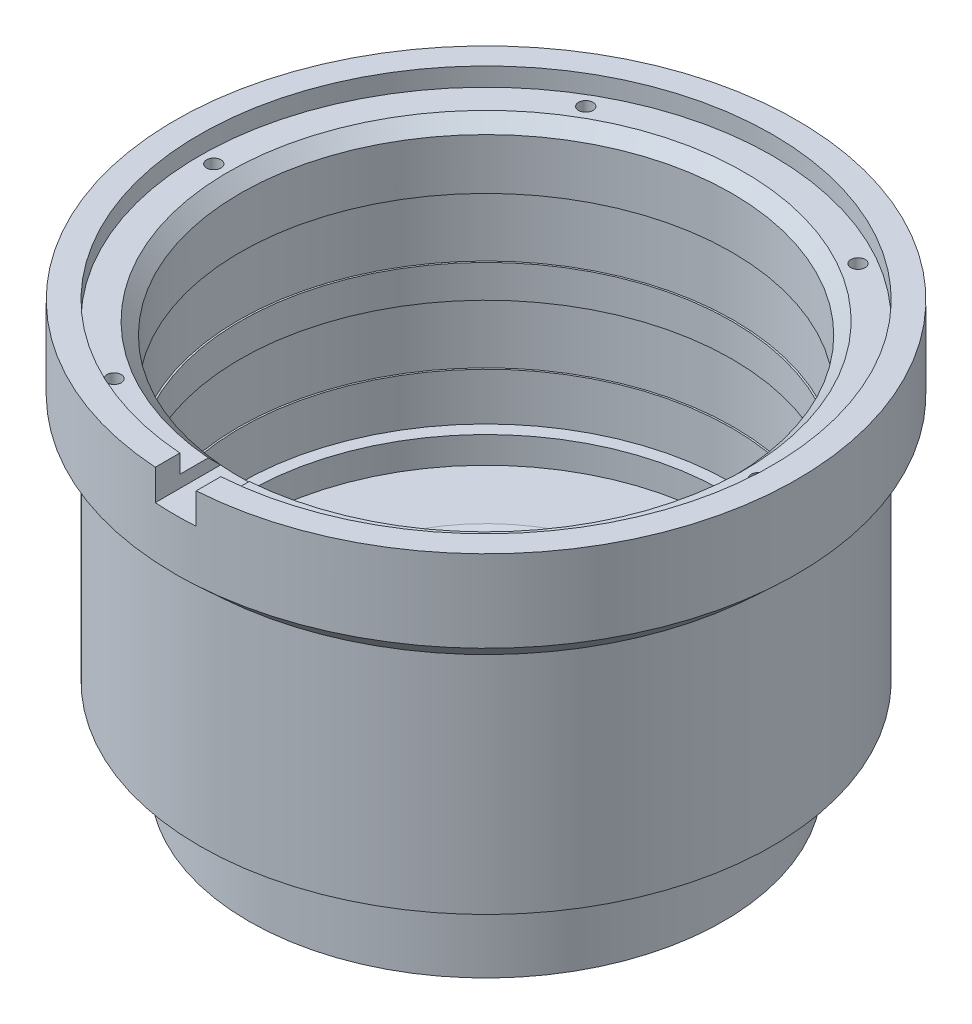
ISO-10303-21;
HEADER;
FILE_DESCRIPTION(('STEP AP214'),'2;1');
FILE_NAME('part.step','',(''),(''),'','','');
FILE_SCHEMA(('AUTOMOTIVE_DESIGN { 1 0 10303 214 1 1 1 1 }'));
ENDSEC;
DATA;
#1=APPLICATION_CONTEXT('core data for automotive mechanical design processes');
#2=APPLICATION_PROTOCOL_DEFINITION('international standard','automotive_design',2000,#1);
#3=PRODUCT_CONTEXT('',#1,'mechanical');
#4=PRODUCT('Part','Part','',(#3));
#5=PRODUCT_RELATED_PRODUCT_CATEGORY('part','',(#4));
#6=PRODUCT_DEFINITION_FORMATION('','',#4);
#7=PRODUCT_DEFINITION_CONTEXT('part definition',#1,'design');
#8=PRODUCT_DEFINITION('design','',#6,#7);
#9=PRODUCT_DEFINITION_SHAPE('','',#8);
#10=(LENGTH_UNIT() NAMED_UNIT(*) SI_UNIT(.MILLI.,.METRE.));
#11=(NAMED_UNIT(*) PLANE_ANGLE_UNIT() SI_UNIT($,.RADIAN.));
#12=(NAMED_UNIT(*) SI_UNIT($,.STERADIAN.) SOLID_ANGLE_UNIT());
#13=UNCERTAINTY_MEASURE_WITH_UNIT(LENGTH_MEASURE(1.E-05),#10,'distance_accuracy_value','');
#14=(GEOMETRIC_REPRESENTATION_CONTEXT(3) GLOBAL_UNCERTAINTY_ASSIGNED_CONTEXT((#13)) GLOBAL_UNIT_ASSIGNED_CONTEXT((#10,
#11,#12)) REPRESENTATION_CONTEXT('',''));
#15=CARTESIAN_POINT('',(0.,0.,0.));
#16=DIRECTION('',(0.,0.,1.));
#17=DIRECTION('',(1.,0.,0.));
#18=AXIS2_PLACEMENT_3D('',#15,#16,#17);
#19=CARTESIAN_POINT('',(0.,-30.2318711174091,0.));
#20=DIRECTION('',(0.,-1.,0.));
#21=DIRECTION('',(0.,0.,-1.));
#22=AXIS2_PLACEMENT_3D('',#19,#20,#21);
#23=CYLINDRICAL_SURFACE('',#22,30.0375);
#24=CARTESIAN_POINT('',(0.,34.31,0.));
#25=DIRECTION('',(0.,-1.,0.));
#26=DIRECTION('',(0.,0.,-1.));
#27=AXIS2_PLACEMENT_3D('',#24,#25,#26);
#28=CIRCLE('',#27,30.0375);
#29=CARTESIAN_POINT('',(-2.5,34.31,29.9332825839399));
#30=VERTEX_POINT('',#29);
#31=CARTESIAN_POINT('',(2.5,34.31,29.9332825839399));
#32=VERTEX_POINT('',#31);
#33=EDGE_CURVE('E111',#30,#32,#28,.F.);
#34=ORIENTED_EDGE('',*,*,#33,.T.);
#35=EDGE_CURVE('E117',#32,#30,#28,.F.);
#36=ORIENTED_EDGE('',*,*,#35,.T.);
#37=EDGE_LOOP('',(#34,#36));
#38=FACE_BOUND('',#37,.T.);
#39=CARTESIAN_POINT('',(0.,28.0847222222222,0.));
#40=DIRECTION('',(0.,-1.,0.));
#41=DIRECTION('',(0.,0.,-1.));
#42=AXIS2_PLACEMENT_3D('',#39,#40,#41);
#43=CIRCLE('',#42,30.0375);
#44=CARTESIAN_POINT('',(0.,28.0847222222222,-30.0375));
#45=VERTEX_POINT('',#44);
#46=EDGE_CURVE('E338',#45,#45,#43,.T.);
#47=ORIENTED_EDGE('',*,*,#46,.T.);
#48=EDGE_LOOP('',(#47));
#49=FACE_BOUND('',#48,.T.);
#50=ADVANCED_FACE('F41',(#38,#49),#23,.F.);
#51=CARTESIAN_POINT('',(0.,3.68801270189219,0.));
#52=DIRECTION('',(0.,-1.,0.));
#53=DIRECTION('',(0.,0.,-1.));
#54=AXIS2_PLACEMENT_3D('',#51,#52,#53);
#55=CIRCLE('',#54,30.0375);
#56=CARTESIAN_POINT('',(0.,3.68801270189219,-30.0375));
#57=VERTEX_POINT('',#56);
#58=EDGE_CURVE('E335',#57,#57,#55,.T.);
#59=ORIENTED_EDGE('',*,*,#58,.T.);
#60=EDGE_LOOP('',(#59));
#61=FACE_BOUND('',#60,.T.);
#62=CARTESIAN_POINT('',(0.,9.48027777777775,0.));
#63=DIRECTION('',(0.,-1.,0.));
#64=DIRECTION('',(0.,0.,-1.));
#65=AXIS2_PLACEMENT_3D('',#62,#63,#64);
#66=CIRCLE('',#65,30.0375);
#67=CARTESIAN_POINT('',(0.,9.48027777777775,-30.0375));
#68=VERTEX_POINT('',#67);
#69=EDGE_CURVE('E339',#68,#68,#66,.T.);
#70=ORIENTED_EDGE('',*,*,#69,.F.);
#71=EDGE_LOOP('',(#70));
#72=FACE_BOUND('',#71,.T.);
#73=ADVANCED_FACE('F160',(#61,#72),#23,.F.);
#74=CARTESIAN_POINT('',(-12.,-13.19,0.));
#75=DIRECTION('',(0.,1.,0.));
#76=DIRECTION('',(0.,0.,1.));
#77=AXIS2_PLACEMENT_3D('',#74,#75,#76);
#78=PLANE('',#77);
#79=CARTESIAN_POINT('',(0.,-13.19,0.));
#80=DIRECTION('',(0.,-1.,0.));
#81=DIRECTION('',(0.,0.,-1.));
#82=AXIS2_PLACEMENT_3D('',#79,#80,#81);
#83=CIRCLE('',#82,12.);
#84=CARTESIAN_POINT('',(0.,-13.19,-12.));
#85=VERTEX_POINT('',#84);
#86=EDGE_CURVE('E226',#85,#85,#83,.T.);
#87=ORIENTED_EDGE('',*,*,#86,.F.);
#88=EDGE_LOOP('',(#87));
#89=FACE_BOUND('',#88,.T.);
#90=CARTESIAN_POINT('',(-12.5,-13.19,21.650635094611));
#91=DIRECTION('',(0.,-1.,0.));
#92=DIRECTION('',(0.,0.,-1.));
#93=AXIS2_PLACEMENT_3D('',#90,#91,#92);
#94=CIRCLE('',#93,1.375);
#95=CARTESIAN_POINT('',(-12.5,-13.19,20.275635094611));
#96=VERTEX_POINT('',#95);
#97=EDGE_CURVE('E304',#96,#96,#94,.T.);
#98=ORIENTED_EDGE('',*,*,#97,.F.);
#99=EDGE_LOOP('',(#98));
#100=FACE_BOUND('',#99,.T.);
#101=CARTESIAN_POINT('',(12.5,-13.19,21.650635094611));
#102=DIRECTION('',(0.,-1.,0.));
#103=DIRECTION('',(0.,0.,-1.));
#104=AXIS2_PLACEMENT_3D('',#101,#102,#103);
#105=CIRCLE('',#104,1.375);
#106=CARTESIAN_POINT('',(12.5,-13.19,20.275635094611));
#107=VERTEX_POINT('',#106);
#108=EDGE_CURVE('E298',#107,#107,#105,.T.);
#109=ORIENTED_EDGE('',*,*,#108,.F.);
#110=EDGE_LOOP('',(#109));
#111=FACE_BOUND('',#110,.T.);
#112=CARTESIAN_POINT('',(25.,-13.19,0.));
#113=DIRECTION('',(0.,-1.,0.));
#114=DIRECTION('',(0.,0.,-1.));
#115=AXIS2_PLACEMENT_3D('',#112,#113,#114);
#116=CIRCLE('',#115,1.375);
#117=CARTESIAN_POINT('',(25.,-13.19,-1.375));
#118=VERTEX_POINT('',#117);
#119=EDGE_CURVE('E292',#118,#118,#116,.T.);
#120=ORIENTED_EDGE('',*,*,#119,.F.);
#121=EDGE_LOOP('',(#120));
#122=FACE_BOUND('',#121,.T.);
#123=CARTESIAN_POINT('',(12.5,-13.19,-21.650635094611));
#124=DIRECTION('',(0.,-1.,0.));
#125=DIRECTION('',(0.,0.,-1.));
#126=AXIS2_PLACEMENT_3D('',#123,#124,#125);
#127=CIRCLE('',#126,1.375);
#128=CARTESIAN_POINT('',(12.5,-13.19,-23.025635094611));
#129=VERTEX_POINT('',#128);
#130=EDGE_CURVE('E285',#129,#129,#127,.T.);
#131=ORIENTED_EDGE('',*,*,#130,.F.);
#132=EDGE_LOOP('',(#131));
#133=FACE_BOUND('',#132,.T.);
#134=CARTESIAN_POINT('',(-12.5,-13.19,-21.650635094611));
#135=DIRECTION('',(0.,-1.,0.));
#136=DIRECTION('',(0.,0.,-1.));
#137=AXIS2_PLACEMENT_3D('',#134,#135,#136);
#138=CIRCLE('',#137,1.375);
#139=CARTESIAN_POINT('',(-12.5,-13.19,-23.025635094611));
#140=VERTEX_POINT('',#139);
#141=EDGE_CURVE('E286',#140,#140,#138,.T.);
#142=ORIENTED_EDGE('',*,*,#141,.F.);
#143=EDGE_LOOP('',(#142));
#144=FACE_BOUND('',#143,.T.);
#145=CARTESIAN_POINT('',(-25.,-13.19,0.));
#146=DIRECTION('',(0.,-1.,0.));
#147=DIRECTION('',(0.,0.,-1.));
#148=AXIS2_PLACEMENT_3D('',#145,#146,#147);
#149=CIRCLE('',#148,1.375);
#150=CARTESIAN_POINT('',(-25.,-13.19,-1.375));
#151=VERTEX_POINT('',#150);
#152=EDGE_CURVE('E307',#151,#151,#149,.T.);
#153=ORIENTED_EDGE('',*,*,#152,.F.);
#154=EDGE_LOOP('',(#153));
#155=FACE_BOUND('',#154,.T.);
#156=CARTESIAN_POINT('',(0.,-13.19,0.));
#157=DIRECTION('',(0.,1.,0.));
#158=DIRECTION('',(0.,0.,1.));
#159=AXIS2_PLACEMENT_3D('',#156,#157,#158);
#160=CIRCLE('',#159,29.);
#161=CARTESIAN_POINT('',(0.,-13.19,29.));
#162=VERTEX_POINT('',#161);
#163=EDGE_CURVE('E311',#162,#162,#160,.T.);
#164=ORIENTED_EDGE('',*,*,#163,.F.);
#165=EDGE_LOOP('',(#164));
#166=FACE_BOUND('',#165,.T.);
#167=ADVANCED_FACE('F156',(#89,#100,#111,#122,#133,#144,#155,#166),#78,.F.);
#168=CARTESIAN_POINT('',(-38.,38.06,0.));
#169=DIRECTION('',(0.,-1.,0.));
#170=DIRECTION('',(0.,0.,-1.));
#171=AXIS2_PLACEMENT_3D('',#168,#169,#170);
#172=PLANE('',#171);
#173=CARTESIAN_POINT('',(0.,38.06,0.));
#174=DIRECTION('',(0.,-1.,0.));
#175=DIRECTION('',(0.,0.,-1.));
#176=AXIS2_PLACEMENT_3D('',#173,#174,#175);
#177=CIRCLE('',#176,35.);
#178=CARTESIAN_POINT('',(-2.5,38.06,34.9106001094224));
#179=VERTEX_POINT('',#178);
#180=CARTESIAN_POINT('',(2.5,38.06,34.9106001094224));
#181=VERTEX_POINT('',#180);
#182=EDGE_CURVE('E203',#179,#181,#177,.T.);
#183=ORIENTED_EDGE('',*,*,#182,.T.);
#184=DIRECTION('',(0.,0.,-1.));
#185=VECTOR('',#184,1.);
#186=CARTESIAN_POINT('',(2.5,38.06,38.));
#187=LINE('',#186,#185);
#188=CARTESIAN_POINT('',(2.5,38.06,37.9176739792936));
#189=VERTEX_POINT('',#188);
#190=EDGE_CURVE('E114',#189,#181,#187,.T.);
#191=ORIENTED_EDGE('',*,*,#190,.F.);
#192=CARTESIAN_POINT('',(0.,38.06,0.));
#193=DIRECTION('',(0.,-1.,0.));
#194=DIRECTION('',(0.,0.,-1.));
#195=AXIS2_PLACEMENT_3D('',#192,#193,#194);
#196=CIRCLE('',#195,38.);
#197=CARTESIAN_POINT('',(-2.5,38.06,37.9176739792936));
#198=VERTEX_POINT('',#197);
#199=EDGE_CURVE('E208',#198,#189,#196,.T.);
#200=ORIENTED_EDGE('',*,*,#199,.F.);
#201=DIRECTION('',(0.,0.,1.));
#202=VECTOR('',#201,1.);
#203=CARTESIAN_POINT('',(-2.5,38.06,38.));
#204=LINE('',#203,#202);
#205=EDGE_CURVE('E206',#179,#198,#204,.T.);
#206=ORIENTED_EDGE('',*,*,#205,.F.);
#207=EDGE_LOOP('',(#183,#191,#200,#206));
#208=FACE_BOUND('',#207,.T.);
#209=ADVANCED_FACE('F159',(#208),#172,.F.);
#210=CARTESIAN_POINT('',(0.,-30.2318711174091,0.));
#211=DIRECTION('',(0.,-1.,0.));
#212=DIRECTION('',(0.,0.,-1.));
#213=AXIS2_PLACEMENT_3D('',#210,#211,#212);
#214=CYLINDRICAL_SURFACE('',#213,35.);
#215=CARTESIAN_POINT('',(0.,35.81,0.));
#216=DIRECTION('',(0.,-1.,0.));
#217=DIRECTION('',(0.,0.,-1.));
#218=AXIS2_PLACEMENT_3D('',#215,#216,#217);
#219=CIRCLE('',#218,35.);
#220=CARTESIAN_POINT('',(-2.49999999999999,35.81,34.9106001094224));
#221=VERTEX_POINT('',#220);
#222=CARTESIAN_POINT('',(2.5,35.81,34.9106001094224));
#223=VERTEX_POINT('',#222);
#224=EDGE_CURVE('E209',#221,#223,#219,.T.);
#225=ORIENTED_EDGE('',*,*,#224,.T.);
#226=DIRECTION('',(0.,-1.,0.));
#227=VECTOR('',#226,1.);
#228=CARTESIAN_POINT('',(2.5,-30.2318711174091,34.9106001094224));
#229=LINE('',#228,#227);
#230=EDGE_CURVE('E70',#223,#181,#229,.F.);
#231=ORIENTED_EDGE('',*,*,#230,.T.);
#232=ORIENTED_EDGE('',*,*,#182,.F.);
#233=DIRECTION('',(0.,-1.,0.));
#234=VECTOR('',#233,1.);
#235=CARTESIAN_POINT('',(-2.49999999999999,-30.2318711174091,34.9106001094224));
#236=LINE('',#235,#234);
#237=EDGE_CURVE('E237',#179,#221,#236,.T.);
#238=ORIENTED_EDGE('',*,*,#237,.T.);
#239=EDGE_LOOP('',(#225,#231,#232,#238));
#240=FACE_BOUND('',#239,.T.);
#241=ADVANCED_FACE('F191',(#240),#214,.F.);
#242=CARTESIAN_POINT('',(-35.,35.81,0.));
#243=DIRECTION('',(0.,-1.,0.));
#244=DIRECTION('',(0.,0.,-1.));
#245=AXIS2_PLACEMENT_3D('',#242,#243,#244);
#246=PLANE('',#245);
#247=CARTESIAN_POINT('',(-33.26875,35.81,0.));
#248=DIRECTION('',(0.,1.,0.));
#249=DIRECTION('',(0.,0.,1.));
#250=AXIS2_PLACEMENT_3D('',#247,#248,#249);
#251=CIRCLE('',#250,0.874999999999998);
#252=CARTESIAN_POINT('',(-33.26875,35.81,0.874999999999999));
#253=VERTEX_POINT('',#252);
#254=EDGE_CURVE('E271',#253,#253,#251,.T.);
#255=ORIENTED_EDGE('',*,*,#254,.F.);
#256=EDGE_LOOP('',(#255));
#257=FACE_BOUND('',#256,.T.);
#258=CARTESIAN_POINT('',(-16.634375,35.81,28.8115826521536));
#259=DIRECTION('',(0.,1.,0.));
#260=DIRECTION('',(0.,0.,1.));
#261=AXIS2_PLACEMENT_3D('',#258,#259,#260);
#262=CIRCLE('',#261,0.875000000000002);
#263=CARTESIAN_POINT('',(-16.634375,35.81,29.6865826521536));
#264=VERTEX_POINT('',#263);
#265=EDGE_CURVE('E250',#264,#264,#262,.T.);
#266=ORIENTED_EDGE('',*,*,#265,.F.);
#267=EDGE_LOOP('',(#266));
#268=FACE_BOUND('',#267,.T.);
#269=CARTESIAN_POINT('',(16.634375,35.81,28.8115826521536));
#270=DIRECTION('',(0.,1.,0.));
#271=DIRECTION('',(0.,0.,1.));
#272=AXIS2_PLACEMENT_3D('',#269,#270,#271);
#273=CIRCLE('',#272,0.875000000000002);
#274=CARTESIAN_POINT('',(16.634375,35.81,29.6865826521536));
#275=VERTEX_POINT('',#274);
#276=EDGE_CURVE('E249',#275,#275,#273,.T.);
#277=ORIENTED_EDGE('',*,*,#276,.F.);
#278=EDGE_LOOP('',(#277));
#279=FACE_BOUND('',#278,.T.);
#280=CARTESIAN_POINT('',(33.26875,35.81,0.));
#281=DIRECTION('',(0.,1.,0.));
#282=DIRECTION('',(0.,0.,1.));
#283=AXIS2_PLACEMENT_3D('',#280,#281,#282);
#284=CIRCLE('',#283,0.874999999999998);
#285=CARTESIAN_POINT('',(33.26875,35.81,0.874999999999994));
#286=VERTEX_POINT('',#285);
#287=EDGE_CURVE('E256',#286,#286,#284,.T.);
#288=ORIENTED_EDGE('',*,*,#287,.F.);
#289=EDGE_LOOP('',(#288));
#290=FACE_BOUND('',#289,.T.);
#291=CARTESIAN_POINT('',(16.634375,35.81,-28.8115826521536));
#292=DIRECTION('',(0.,1.,0.));
#293=DIRECTION('',(0.,0.,1.));
#294=AXIS2_PLACEMENT_3D('',#291,#292,#293);
#295=CIRCLE('',#294,0.875000000000002);
#296=CARTESIAN_POINT('',(16.634375,35.81,-27.9365826521536));
#297=VERTEX_POINT('',#296);
#298=EDGE_CURVE('E262',#297,#297,#295,.T.);
#299=ORIENTED_EDGE('',*,*,#298,.F.);
#300=EDGE_LOOP('',(#299));
#301=FACE_BOUND('',#300,.T.);
#302=CARTESIAN_POINT('',(-16.634375,35.81,-28.8115826521536));
#303=DIRECTION('',(0.,1.,0.));
#304=DIRECTION('',(0.,0.,1.));
#305=AXIS2_PLACEMENT_3D('',#302,#303,#304);
#306=CIRCLE('',#305,0.875000000000002);
#307=CARTESIAN_POINT('',(-16.634375,35.81,-27.9365826521536));
#308=VERTEX_POINT('',#307);
#309=EDGE_CURVE('E268',#308,#308,#306,.T.);
#310=ORIENTED_EDGE('',*,*,#309,.F.);
#311=EDGE_LOOP('',(#310));
#312=FACE_BOUND('',#311,.T.);
#313=CARTESIAN_POINT('',(0.,35.81,0.));
#314=DIRECTION('',(0.,-1.,0.));
#315=DIRECTION('',(0.,0.,-1.));
#316=AXIS2_PLACEMENT_3D('',#313,#314,#315);
#317=CIRCLE('',#316,31.5375);
#318=CARTESIAN_POINT('',(-2.5,35.81,31.4382554581199));
#319=VERTEX_POINT('',#318);
#320=CARTESIAN_POINT('',(2.5,35.81,31.4382554581199));
#321=VERTEX_POINT('',#320);
#322=EDGE_CURVE('E120',#319,#321,#317,.T.);
#323=ORIENTED_EDGE('',*,*,#322,.T.);
#324=DIRECTION('',(0.,0.,1.));
#325=VECTOR('',#324,1.);
#326=CARTESIAN_POINT('',(2.49999999999999,35.81,0.));
#327=LINE('',#326,#325);
#328=EDGE_CURVE('E103',#321,#223,#327,.T.);
#329=ORIENTED_EDGE('',*,*,#328,.T.);
#330=ORIENTED_EDGE('',*,*,#224,.F.);
#331=DIRECTION('',(0.,0.,-1.));
#332=VECTOR('',#331,1.);
#333=CARTESIAN_POINT('',(-2.5,35.81,0.));
#334=LINE('',#333,#332);
#335=EDGE_CURVE('E239',#221,#319,#334,.T.);
#336=ORIENTED_EDGE('',*,*,#335,.T.);
#337=EDGE_LOOP('',(#323,#329,#330,#336));
#338=FACE_BOUND('',#337,.T.);
#339=ADVANCED_FACE('F184',(#257,#268,#279,#290,#301,#312,#338),#246,.F.);
#340=CARTESIAN_POINT('',(-30.0375,3.255,0.));
#341=DIRECTION('',(0.,-1.,0.));
#342=DIRECTION('',(0.,0.,-1.));
#343=AXIS2_PLACEMENT_3D('',#340,#341,#342);
#344=PLANE('',#343);
#345=CARTESIAN_POINT('',(0.,3.25500000000002,0.));
#346=DIRECTION('',(0.,-1.,0.));
#347=DIRECTION('',(0.,0.,-1.));
#348=AXIS2_PLACEMENT_3D('',#345,#346,#347);
#349=CIRCLE('',#348,29.0749999999999);
#350=CARTESIAN_POINT('',(0.,3.25500000000002,-29.0749999999999));
#351=VERTEX_POINT('',#350);
#352=EDGE_CURVE('E212',#351,#351,#349,.T.);
#353=ORIENTED_EDGE('',*,*,#352,.T.);
#354=EDGE_LOOP('',(#353));
#355=FACE_BOUND('',#354,.T.);
#356=CARTESIAN_POINT('',(0.,3.25499999999998,0.));
#357=DIRECTION('',(0.,-1.,0.));
#358=DIRECTION('',(0.,0.,-1.));
#359=AXIS2_PLACEMENT_3D('',#356,#357,#358);
#360=CIRCLE('',#359,30.7875);
#361=CARTESIAN_POINT('',(0.,3.25499999999998,-30.7875));
#362=VERTEX_POINT('',#361);
#363=EDGE_CURVE('E332',#362,#362,#360,.T.);
#364=ORIENTED_EDGE('',*,*,#363,.F.);
#365=EDGE_LOOP('',(#364));
#366=FACE_BOUND('',#365,.T.);
#367=ADVANCED_FACE('F180',(#355,#366),#344,.F.);
#368=CARTESIAN_POINT('',(0.,-30.2318711174091,0.));
#369=DIRECTION('',(0.,-1.,0.));
#370=DIRECTION('',(0.,0.,-1.));
#371=AXIS2_PLACEMENT_3D('',#368,#369,#370);
#372=CYLINDRICAL_SURFACE('',#371,29.0749999999999);
#373=ORIENTED_EDGE('',*,*,#352,.F.);
#374=EDGE_LOOP('',(#373));
#375=FACE_BOUND('',#374,.T.);
#376=CARTESIAN_POINT('',(0.,0.,0.));
#377=DIRECTION('',(0.,-1.,0.));
#378=DIRECTION('',(0.,0.,-1.));
#379=AXIS2_PLACEMENT_3D('',#376,#377,#378);
#380=CIRCLE('',#379,29.0749999999999);
#381=CARTESIAN_POINT('',(0.,0.,-29.0749999999999));
#382=VERTEX_POINT('',#381);
#383=EDGE_CURVE('E217',#382,#382,#380,.T.);
#384=ORIENTED_EDGE('',*,*,#383,.T.);
#385=EDGE_LOOP('',(#384));
#386=FACE_BOUND('',#385,.T.);
#387=ADVANCED_FACE('F176',(#375,#386),#372,.F.);
#388=CARTESIAN_POINT('',(-9.,0.,0.));
#389=DIRECTION('',(0.,-1.,0.));
#390=DIRECTION('',(0.,0.,-1.));
#391=AXIS2_PLACEMENT_3D('',#388,#389,#390);
#392=PLANE('',#391);
#393=CARTESIAN_POINT('',(0.,0.,0.));
#394=DIRECTION('',(0.,-1.,0.));
#395=DIRECTION('',(0.,0.,-1.));
#396=AXIS2_PLACEMENT_3D('',#393,#394,#395);
#397=CIRCLE('',#396,20.3425636392354);
#398=CARTESIAN_POINT('',(0.,0.,-20.3425636392354));
#399=VERTEX_POINT('',#398);
#400=EDGE_CURVE('E123',#399,#399,#397,.T.);
#401=ORIENTED_EDGE('',*,*,#400,.T.);
#402=EDGE_LOOP('',(#401));
#403=FACE_BOUND('',#402,.T.);
#404=ORIENTED_EDGE('',*,*,#383,.F.);
#405=EDGE_LOOP('',(#404));
#406=FACE_BOUND('',#405,.T.);
#407=ADVANCED_FACE('F172',(#403,#406),#392,.F.);
#408=CARTESIAN_POINT('',(0.,-30.2318711174091,0.));
#409=DIRECTION('',(0.,-1.,0.));
#410=DIRECTION('',(0.,0.,-1.));
#411=AXIS2_PLACEMENT_3D('',#408,#409,#410);
#412=CYLINDRICAL_SURFACE('',#411,9.);
#413=CARTESIAN_POINT('',(0.,-2.00000000000001,0.));
#414=DIRECTION('',(0.,-1.,0.));
#415=DIRECTION('',(0.,0.,-1.));
#416=AXIS2_PLACEMENT_3D('',#413,#414,#415);
#417=CIRCLE('',#416,9.);
#418=CARTESIAN_POINT('',(0.,-2.00000000000001,-9.));
#419=VERTEX_POINT('',#418);
#420=EDGE_CURVE('E125',#419,#419,#417,.F.);
#421=ORIENTED_EDGE('',*,*,#420,.T.);
#422=EDGE_LOOP('',(#421));
#423=FACE_BOUND('',#422,.T.);
#424=CARTESIAN_POINT('',(0.,-2.94,0.));
#425=DIRECTION('',(0.,-1.,0.));
#426=DIRECTION('',(0.,0.,-1.));
#427=AXIS2_PLACEMENT_3D('',#424,#425,#426);
#428=CIRCLE('',#427,9.);
#429=CARTESIAN_POINT('',(0.,-2.94,-9.));
#430=VERTEX_POINT('',#429);
#431=EDGE_CURVE('E220',#430,#430,#428,.T.);
#432=ORIENTED_EDGE('',*,*,#431,.T.);
#433=EDGE_LOOP('',(#432));
#434=FACE_BOUND('',#433,.T.);
#435=ADVANCED_FACE('F168',(#423,#434),#412,.F.);
#436=CARTESIAN_POINT('',(-9.,-2.94,0.));
#437=DIRECTION('',(0.,1.,0.));
#438=DIRECTION('',(0.,0.,1.));
#439=AXIS2_PLACEMENT_3D('',#436,#437,#438);
#440=PLANE('',#439);
#441=ORIENTED_EDGE('',*,*,#431,.F.);
#442=EDGE_LOOP('',(#441));
#443=FACE_BOUND('',#442,.T.);
#444=CARTESIAN_POINT('',(0.,-2.94,0.));
#445=DIRECTION('',(0.,-1.,0.));
#446=DIRECTION('',(0.,0.,-1.));
#447=AXIS2_PLACEMENT_3D('',#444,#445,#446);
#448=CIRCLE('',#447,12.);
#449=CARTESIAN_POINT('',(0.,-2.94,-12.));
#450=VERTEX_POINT('',#449);
#451=EDGE_CURVE('E223',#450,#450,#448,.T.);
#452=ORIENTED_EDGE('',*,*,#451,.T.);
#453=EDGE_LOOP('',(#452));
#454=FACE_BOUND('',#453,.T.);
#455=ADVANCED_FACE('F164',(#443,#454),#440,.F.);
#456=CARTESIAN_POINT('',(0.,-30.2318711174091,0.));
#457=DIRECTION('',(0.,-1.,0.));
#458=DIRECTION('',(0.,0.,-1.));
#459=AXIS2_PLACEMENT_3D('',#456,#457,#458);
#460=CYLINDRICAL_SURFACE('',#459,12.);
#461=ORIENTED_EDGE('',*,*,#451,.F.);
#462=EDGE_LOOP('',(#461));
#463=FACE_BOUND('',#462,.T.);
#464=ORIENTED_EDGE('',*,*,#86,.T.);
#465=EDGE_LOOP('',(#464));
#466=FACE_BOUND('',#465,.T.);
#467=ADVANCED_FACE('F154',(#463,#466),#460,.F.);
#468=CARTESIAN_POINT('',(0.,-30.2318711174091,0.));
#469=DIRECTION('',(0.,-1.,0.));
#470=DIRECTION('',(0.,0.,-1.));
#471=AXIS2_PLACEMENT_3D('',#468,#469,#470);
#472=CYLINDRICAL_SURFACE('',#471,38.);
#473=CARTESIAN_POINT('',(0.,28.06,0.));
#474=DIRECTION('',(0.,1.,0.));
#475=DIRECTION('',(0.,0.,1.));
#476=AXIS2_PLACEMENT_3D('',#473,#474,#475);
#477=CIRCLE('',#476,38.);
#478=CARTESIAN_POINT('',(0.,28.06,38.));
#479=VERTEX_POINT('',#478);
#480=EDGE_CURVE('E329',#479,#479,#477,.T.);
#481=ORIENTED_EDGE('',*,*,#480,.T.);
#482=EDGE_LOOP('',(#481));
#483=FACE_BOUND('',#482,.T.);
#484=ORIENTED_EDGE('',*,*,#199,.T.);
#485=DIRECTION('',(0.,-1.,0.));
#486=VECTOR('',#485,1.);
#487=CARTESIAN_POINT('',(2.5,-30.2318711174091,37.9176739792936));
#488=LINE('',#487,#486);
#489=CARTESIAN_POINT('',(2.5,34.31,37.9176739792936));
#490=VERTEX_POINT('',#489);
#491=EDGE_CURVE('E230',#189,#490,#488,.T.);
#492=ORIENTED_EDGE('',*,*,#491,.T.);
#493=CARTESIAN_POINT('',(0.,34.31,0.));
#494=DIRECTION('',(0.,-1.,0.));
#495=DIRECTION('',(0.,0.,-1.));
#496=AXIS2_PLACEMENT_3D('',#493,#494,#495);
#497=CIRCLE('',#496,38.);
#498=CARTESIAN_POINT('',(-2.5,34.31,37.9176739792936));
#499=VERTEX_POINT('',#498);
#500=EDGE_CURVE('E113',#490,#499,#497,.T.);
#501=ORIENTED_EDGE('',*,*,#500,.T.);
#502=DIRECTION('',(0.,-1.,0.));
#503=VECTOR('',#502,1.);
#504=CARTESIAN_POINT('',(-2.49999999999999,-30.2318711174091,37.9176739792936));
#505=LINE('',#504,#503);
#506=EDGE_CURVE('E234',#499,#198,#505,.F.);
#507=ORIENTED_EDGE('',*,*,#506,.T.);
#508=EDGE_LOOP('',(#484,#492,#501,#507));
#509=FACE_BOUND('',#508,.T.);
#510=ADVANCED_FACE('F151',(#483,#509),#472,.T.);
#511=CARTESIAN_POINT('',(0.,35.81,0.));
#512=DIRECTION('',(0.,1.,0.));
#513=DIRECTION('',(0.,0.,1.));
#514=AXIS2_PLACEMENT_3D('',#511,#512,#513);
#515=CONICAL_SURFACE('',#514,31.5375,0.785398163397446);
#516=CARTESIAN_POINT('',(2.5,38.0064498760366,33.6411856842019));
#517=CARTESIAN_POINT('',(2.5,37.5159165604655,33.1492992082921));
#518=CARTESIAN_POINT('',(2.5,37.0254123379568,32.6573837168513));
#519=CARTESIAN_POINT('',(2.5,36.0444718161019,31.6734850406488));
#520=CARTESIAN_POINT('',(2.5,35.5540355167539,31.1815018558888));
#521=CARTESIAN_POINT('',(2.5,34.5732405497735,30.197458102226));
#522=CARTESIAN_POINT('',(2.5,34.0828818821416,29.7053975333225));
#523=CARTESIAN_POINT('',(2.5,33.10225516573,28.7211860822988));
#524=CARTESIAN_POINT('',(2.5,32.6119871169527,28.2290352001761));
#525=CARTESIAN_POINT('',(2.5,32.1217708821292,27.7368327079033));
#526=B_SPLINE_CURVE_WITH_KNOTS('',3,(#516,#517,#518,#519,#520,#521,#522,#523,#524,#525),
.UNSPECIFIED.,.F.,.F.,(4,2,2,2,4),(0.,2.08402906775424,4.16805808201208,6.25208711029378,
8.33611619216076),.UNSPECIFIED.);
#527=EDGE_CURVE('E12',#321,#32,#526,.T.);
#528=ORIENTED_EDGE('',*,*,#527,.F.);
#529=ORIENTED_EDGE('',*,*,#322,.F.);
#530=CARTESIAN_POINT('',(-2.5,32.1217708821292,27.7368327079033));
#531=CARTESIAN_POINT('',(-2.5,32.6119871169527,28.2290352001761));
#532=CARTESIAN_POINT('',(-2.5,33.10225516573,28.7211860822988));
#533=CARTESIAN_POINT('',(-2.5,34.0828818821416,29.7053975333225));
#534=CARTESIAN_POINT('',(-2.5,34.5732405497735,30.197458102226));
#535=CARTESIAN_POINT('',(-2.5,35.5540355167539,31.1815018558888));
#536=CARTESIAN_POINT('',(-2.5,36.0444718161019,31.6734850406488));
#537=CARTESIAN_POINT('',(-2.5,37.0254123379568,32.6573837168513));
#538=CARTESIAN_POINT('',(-2.5,37.5159165604655,33.1492992082921));
#539=CARTESIAN_POINT('',(-2.5,38.0064498760366,33.6411856842019));
#540=B_SPLINE_CURVE_WITH_KNOTS('',3,(#530,#531,#532,#533,#534,#535,#536,#537,#538,#539),
.UNSPECIFIED.,.F.,.F.,(4,2,2,2,4),(0.,2.08402908186698,4.16805811014868,6.25208712440652,
8.33611619216076),.UNSPECIFIED.);
#541=EDGE_CURVE('E55',#30,#319,#540,.T.);
#542=ORIENTED_EDGE('',*,*,#541,.F.);
#543=ORIENTED_EDGE('',*,*,#35,.F.);
#544=EDGE_LOOP('',(#528,#529,#542,#543));
#545=FACE_BOUND('',#544,.T.);
#546=ADVANCED_FACE('F118',(#545),#515,.F.);
#547=CARTESIAN_POINT('',(0.,0.,0.));
#548=DIRECTION('',(0.,1.,0.));
#549=DIRECTION('',(0.,0.,1.));
#550=AXIS2_PLACEMENT_3D('',#547,#548,#549);
#551=CONICAL_SURFACE('',#550,20.3425636392354,1.39626340159546);
#552=ORIENTED_EDGE('',*,*,#420,.F.);
#553=EDGE_LOOP('',(#552));
#554=FACE_BOUND('',#553,.T.);
#555=ORIENTED_EDGE('',*,*,#400,.F.);
#556=EDGE_LOOP('',(#555));
#557=FACE_BOUND('',#556,.T.);
#558=ADVANCED_FACE('F44',(#554,#557),#551,.F.);
#559=CARTESIAN_POINT('',(0.,34.31,0.));
#560=DIRECTION('',(0.,-1.,0.));
#561=DIRECTION('',(0.,0.,-1.));
#562=AXIS2_PLACEMENT_3D('',#559,#560,#561);
#563=PLANE('',#562);
#564=DIRECTION('',(0.,0.,-1.));
#565=VECTOR('',#564,1.);
#566=CARTESIAN_POINT('',(2.5,34.31,38.));
#567=LINE('',#566,#565);
#568=EDGE_CURVE('E101',#490,#32,#567,.T.);
#569=ORIENTED_EDGE('',*,*,#568,.T.);
#570=ORIENTED_EDGE('',*,*,#33,.F.);
#571=DIRECTION('',(0.,0.,1.));
#572=VECTOR('',#571,1.);
#573=CARTESIAN_POINT('',(-2.5,34.31,38.));
#574=LINE('',#573,#572);
#575=EDGE_CURVE('E62',#30,#499,#574,.T.);
#576=ORIENTED_EDGE('',*,*,#575,.T.);
#577=ORIENTED_EDGE('',*,*,#500,.F.);
#578=EDGE_LOOP('',(#569,#570,#576,#577));
#579=FACE_BOUND('',#578,.T.);
#580=ADVANCED_FACE('F109',(#579),#563,.F.);
#581=CARTESIAN_POINT('',(2.5,24.8193767396146,38.));
#582=DIRECTION('',(1.,0.,0.));
#583=DIRECTION('',(0.,0.,-1.));
#584=AXIS2_PLACEMENT_3D('',#581,#582,#583);
#585=PLANE('',#584);
#586=ORIENTED_EDGE('',*,*,#190,.T.);
#587=ORIENTED_EDGE('',*,*,#230,.F.);
#588=ORIENTED_EDGE('',*,*,#328,.F.);
#589=ORIENTED_EDGE('',*,*,#527,.T.);
#590=ORIENTED_EDGE('',*,*,#568,.F.);
#591=ORIENTED_EDGE('',*,*,#491,.F.);
#592=EDGE_LOOP('',(#586,#587,#588,#589,#590,#591));
#593=FACE_BOUND('',#592,.T.);
#594=ADVANCED_FACE('F100',(#593),#585,.F.);
#595=CARTESIAN_POINT('',(-2.5,24.8193767396146,38.));
#596=DIRECTION('',(-1.,0.,0.));
#597=DIRECTION('',(0.,0.,1.));
#598=AXIS2_PLACEMENT_3D('',#595,#596,#597);
#599=PLANE('',#598);
#600=ORIENTED_EDGE('',*,*,#575,.F.);
#601=ORIENTED_EDGE('',*,*,#541,.T.);
#602=ORIENTED_EDGE('',*,*,#335,.F.);
#603=ORIENTED_EDGE('',*,*,#237,.F.);
#604=ORIENTED_EDGE('',*,*,#205,.T.);
#605=ORIENTED_EDGE('',*,*,#506,.F.);
#606=EDGE_LOOP('',(#600,#601,#602,#603,#604,#605));
#607=FACE_BOUND('',#606,.T.);
#608=ADVANCED_FACE('F139',(#607),#599,.F.);
#609=CARTESIAN_POINT('',(-16.634375,29.81,-28.8115826521536));
#610=DIRECTION('',(0.,1.,0.));
#611=DIRECTION('',(0.,0.,1.));
#612=AXIS2_PLACEMENT_3D('',#609,#610,#611);
#613=CYLINDRICAL_SURFACE('',#612,0.875000000000002);
#614=CARTESIAN_POINT('',(-16.634375,29.81,-28.8115826521536));
#615=DIRECTION('',(0.,1.,0.));
#616=DIRECTION('',(0.,0.,1.));
#617=AXIS2_PLACEMENT_3D('',#614,#615,#616);
#618=CIRCLE('',#617,0.875000000000002);
#619=CARTESIAN_POINT('',(-16.634375,29.81,-27.9365826521536));
#620=VERTEX_POINT('',#619);
#621=EDGE_CURVE('E265',#620,#620,#618,.T.);
#622=ORIENTED_EDGE('',*,*,#621,.F.);
#623=EDGE_LOOP('',(#622));
#624=FACE_BOUND('',#623,.T.);
#625=ORIENTED_EDGE('',*,*,#309,.T.);
#626=EDGE_LOOP('',(#625));
#627=FACE_BOUND('',#626,.T.);
#628=ADVANCED_FACE('F143',(#624,#627),#613,.F.);
#629=CARTESIAN_POINT('',(-16.634375,29.81,-28.8115826521536));
#630=DIRECTION('',(0.,1.,0.));
#631=DIRECTION('',(0.,0.,1.));
#632=AXIS2_PLACEMENT_3D('',#629,#630,#631);
#633=PLANE('',#632);
#634=ORIENTED_EDGE('',*,*,#621,.T.);
#635=EDGE_LOOP('',(#634));
#636=FACE_BOUND('',#635,.T.);
#637=ADVANCED_FACE('F492',(#636),#633,.T.);
#638=CARTESIAN_POINT('',(16.634375,29.81,-28.8115826521536));
#639=DIRECTION('',(0.,1.,0.));
#640=DIRECTION('',(0.,0.,1.));
#641=AXIS2_PLACEMENT_3D('',#638,#639,#640);
#642=CYLINDRICAL_SURFACE('',#641,0.875000000000002);
#643=CARTESIAN_POINT('',(16.634375,29.81,-28.8115826521536));
#644=DIRECTION('',(0.,1.,0.));
#645=DIRECTION('',(0.,0.,1.));
#646=AXIS2_PLACEMENT_3D('',#643,#644,#645);
#647=CIRCLE('',#646,0.875000000000002);
#648=CARTESIAN_POINT('',(16.634375,29.81,-27.9365826521536));
#649=VERTEX_POINT('',#648);
#650=EDGE_CURVE('E259',#649,#649,#647,.T.);
#651=ORIENTED_EDGE('',*,*,#650,.F.);
#652=EDGE_LOOP('',(#651));
#653=FACE_BOUND('',#652,.T.);
#654=ORIENTED_EDGE('',*,*,#298,.T.);
#655=EDGE_LOOP('',(#654));
#656=FACE_BOUND('',#655,.T.);
#657=ADVANCED_FACE('F496',(#653,#656),#642,.F.);
#658=CARTESIAN_POINT('',(16.634375,29.81,-28.8115826521536));
#659=DIRECTION('',(0.,1.,0.));
#660=DIRECTION('',(0.,0.,1.));
#661=AXIS2_PLACEMENT_3D('',#658,#659,#660);
#662=PLANE('',#661);
#663=ORIENTED_EDGE('',*,*,#650,.T.);
#664=EDGE_LOOP('',(#663));
#665=FACE_BOUND('',#664,.T.);
#666=ADVANCED_FACE('F500',(#665),#662,.T.);
#667=CARTESIAN_POINT('',(33.26875,29.81,0.));
#668=DIRECTION('',(0.,1.,0.));
#669=DIRECTION('',(0.,0.,1.));
#670=AXIS2_PLACEMENT_3D('',#667,#668,#669);
#671=CYLINDRICAL_SURFACE('',#670,0.874999999999998);
#672=CARTESIAN_POINT('',(33.26875,29.81,0.));
#673=DIRECTION('',(0.,1.,0.));
#674=DIRECTION('',(0.,0.,1.));
#675=AXIS2_PLACEMENT_3D('',#672,#673,#674);
#676=CIRCLE('',#675,0.874999999999998);
#677=CARTESIAN_POINT('',(33.26875,29.81,0.874999999999994));
#678=VERTEX_POINT('',#677);
#679=EDGE_CURVE('E253',#678,#678,#676,.T.);
#680=ORIENTED_EDGE('',*,*,#679,.F.);
#681=EDGE_LOOP('',(#680));
#682=FACE_BOUND('',#681,.T.);
#683=ORIENTED_EDGE('',*,*,#287,.T.);
#684=EDGE_LOOP('',(#683));
#685=FACE_BOUND('',#684,.T.);
#686=ADVANCED_FACE('F504',(#682,#685),#671,.F.);
#687=CARTESIAN_POINT('',(33.26875,29.81,0.));
#688=DIRECTION('',(0.,1.,0.));
#689=DIRECTION('',(0.,0.,1.));
#690=AXIS2_PLACEMENT_3D('',#687,#688,#689);
#691=PLANE('',#690);
#692=ORIENTED_EDGE('',*,*,#679,.T.);
#693=EDGE_LOOP('',(#692));
#694=FACE_BOUND('',#693,.T.);
#695=ADVANCED_FACE('F508',(#694),#691,.T.);
#696=CARTESIAN_POINT('',(16.634375,29.81,28.8115826521536));
#697=DIRECTION('',(0.,1.,0.));
#698=DIRECTION('',(0.,0.,1.));
#699=AXIS2_PLACEMENT_3D('',#696,#697,#698);
#700=CYLINDRICAL_SURFACE('',#699,0.875000000000002);
#701=CARTESIAN_POINT('',(16.634375,29.81,28.8115826521536));
#702=DIRECTION('',(0.,1.,0.));
#703=DIRECTION('',(0.,0.,1.));
#704=AXIS2_PLACEMENT_3D('',#701,#702,#703);
#705=CIRCLE('',#704,0.875000000000002);
#706=CARTESIAN_POINT('',(16.634375,29.81,29.6865826521536));
#707=VERTEX_POINT('',#706);
#708=EDGE_CURVE('E246',#707,#707,#705,.T.);
#709=ORIENTED_EDGE('',*,*,#708,.F.);
#710=EDGE_LOOP('',(#709));
#711=FACE_BOUND('',#710,.T.);
#712=ORIENTED_EDGE('',*,*,#276,.T.);
#713=EDGE_LOOP('',(#712));
#714=FACE_BOUND('',#713,.T.);
#715=ADVANCED_FACE('F511',(#711,#714),#700,.F.);
#716=CARTESIAN_POINT('',(16.634375,29.81,28.8115826521536));
#717=DIRECTION('',(0.,1.,0.));
#718=DIRECTION('',(0.,0.,1.));
#719=AXIS2_PLACEMENT_3D('',#716,#717,#718);
#720=PLANE('',#719);
#721=ORIENTED_EDGE('',*,*,#708,.T.);
#722=EDGE_LOOP('',(#721));
#723=FACE_BOUND('',#722,.T.);
#724=ADVANCED_FACE('F144',(#723),#720,.T.);
#725=CARTESIAN_POINT('',(-16.634375,29.81,28.8115826521536));
#726=DIRECTION('',(0.,1.,0.));
#727=DIRECTION('',(0.,0.,1.));
#728=AXIS2_PLACEMENT_3D('',#725,#726,#727);
#729=CYLINDRICAL_SURFACE('',#728,0.875000000000002);
#730=CARTESIAN_POINT('',(-16.634375,29.81,28.8115826521536));
#731=DIRECTION('',(0.,1.,0.));
#732=DIRECTION('',(0.,0.,1.));
#733=AXIS2_PLACEMENT_3D('',#730,#731,#732);
#734=CIRCLE('',#733,0.875000000000002);
#735=CARTESIAN_POINT('',(-16.634375,29.81,29.6865826521536));
#736=VERTEX_POINT('',#735);
#737=EDGE_CURVE('E272',#736,#736,#734,.T.);
#738=ORIENTED_EDGE('',*,*,#737,.F.);
#739=EDGE_LOOP('',(#738));
#740=FACE_BOUND('',#739,.T.);
#741=ORIENTED_EDGE('',*,*,#265,.T.);
#742=EDGE_LOOP('',(#741));
#743=FACE_BOUND('',#742,.T.);
#744=ADVANCED_FACE('F483',(#740,#743),#729,.F.);
#745=CARTESIAN_POINT('',(-16.634375,29.81,28.8115826521536));
#746=DIRECTION('',(0.,1.,0.));
#747=DIRECTION('',(0.,0.,1.));
#748=AXIS2_PLACEMENT_3D('',#745,#746,#747);
#749=PLANE('',#748);
#750=ORIENTED_EDGE('',*,*,#737,.T.);
#751=EDGE_LOOP('',(#750));
#752=FACE_BOUND('',#751,.T.);
#753=ADVANCED_FACE('F481',(#752),#749,.T.);
#754=CARTESIAN_POINT('',(-33.26875,29.81,0.));
#755=DIRECTION('',(0.,1.,0.));
#756=DIRECTION('',(0.,0.,1.));
#757=AXIS2_PLACEMENT_3D('',#754,#755,#756);
#758=CYLINDRICAL_SURFACE('',#757,0.874999999999998);
#759=CARTESIAN_POINT('',(-33.26875,29.81,0.));
#760=DIRECTION('',(0.,1.,0.));
#761=DIRECTION('',(0.,0.,1.));
#762=AXIS2_PLACEMENT_3D('',#759,#760,#761);
#763=CIRCLE('',#762,0.874999999999998);
#764=CARTESIAN_POINT('',(-33.26875,29.81,0.874999999999999));
#765=VERTEX_POINT('',#764);
#766=EDGE_CURVE('E244',#765,#765,#763,.T.);
#767=ORIENTED_EDGE('',*,*,#766,.F.);
#768=EDGE_LOOP('',(#767));
#769=FACE_BOUND('',#768,.T.);
#770=ORIENTED_EDGE('',*,*,#254,.T.);
#771=EDGE_LOOP('',(#770));
#772=FACE_BOUND('',#771,.T.);
#773=ADVANCED_FACE('F477',(#769,#772),#758,.F.);
#774=CARTESIAN_POINT('',(-33.26875,29.81,0.));
#775=DIRECTION('',(0.,1.,0.));
#776=DIRECTION('',(0.,0.,1.));
#777=AXIS2_PLACEMENT_3D('',#774,#775,#776);
#778=PLANE('',#777);
#779=ORIENTED_EDGE('',*,*,#766,.T.);
#780=EDGE_LOOP('',(#779));
#781=FACE_BOUND('',#780,.T.);
#782=ADVANCED_FACE('F447',(#781),#778,.T.);
#783=CARTESIAN_POINT('',(-12.5,-8.19000000000001,21.650635094611));
#784=DIRECTION('',(0.,-1.,0.));
#785=DIRECTION('',(0.,0.,-1.));
#786=AXIS2_PLACEMENT_3D('',#783,#784,#785);
#787=CYLINDRICAL_SURFACE('',#786,1.375);
#788=CARTESIAN_POINT('',(-12.5,-8.19000000000001,21.650635094611));
#789=DIRECTION('',(0.,-1.,0.));
#790=DIRECTION('',(0.,0.,-1.));
#791=AXIS2_PLACEMENT_3D('',#788,#789,#790);
#792=CIRCLE('',#791,1.375);
#793=CARTESIAN_POINT('',(-12.5,-8.19000000000001,20.275635094611));
#794=VERTEX_POINT('',#793);
#795=EDGE_CURVE('E301',#794,#794,#792,.T.);
#796=ORIENTED_EDGE('',*,*,#795,.F.);
#797=EDGE_LOOP('',(#796));
#798=FACE_BOUND('',#797,.T.);
#799=ORIENTED_EDGE('',*,*,#97,.T.);
#800=EDGE_LOOP('',(#799));
#801=FACE_BOUND('',#800,.T.);
#802=ADVANCED_FACE('F443',(#798,#801),#787,.F.);
#803=CARTESIAN_POINT('',(-12.5,-8.19000000000001,21.650635094611));
#804=DIRECTION('',(0.,-1.,0.));
#805=DIRECTION('',(0.,0.,-1.));
#806=AXIS2_PLACEMENT_3D('',#803,#804,#805);
#807=PLANE('',#806);
#808=ORIENTED_EDGE('',*,*,#795,.T.);
#809=EDGE_LOOP('',(#808));
#810=FACE_BOUND('',#809,.T.);
#811=ADVANCED_FACE('F446',(#810),#807,.T.);
#812=CARTESIAN_POINT('',(12.5,-8.19000000000001,21.650635094611));
#813=DIRECTION('',(0.,-1.,0.));
#814=DIRECTION('',(0.,0.,-1.));
#815=AXIS2_PLACEMENT_3D('',#812,#813,#814);
#816=CYLINDRICAL_SURFACE('',#815,1.375);
#817=CARTESIAN_POINT('',(12.5,-8.19000000000001,21.650635094611));
#818=DIRECTION('',(0.,-1.,0.));
#819=DIRECTION('',(0.,0.,-1.));
#820=AXIS2_PLACEMENT_3D('',#817,#818,#819);
#821=CIRCLE('',#820,1.375);
#822=CARTESIAN_POINT('',(12.5,-8.19000000000001,20.275635094611));
#823=VERTEX_POINT('',#822);
#824=EDGE_CURVE('E295',#823,#823,#821,.T.);
#825=ORIENTED_EDGE('',*,*,#824,.F.);
#826=EDGE_LOOP('',(#825));
#827=FACE_BOUND('',#826,.T.);
#828=ORIENTED_EDGE('',*,*,#108,.T.);
#829=EDGE_LOOP('',(#828));
#830=FACE_BOUND('',#829,.T.);
#831=ADVANCED_FACE('F451',(#827,#830),#816,.F.);
#832=CARTESIAN_POINT('',(12.5,-8.19000000000001,21.650635094611));
#833=DIRECTION('',(0.,-1.,0.));
#834=DIRECTION('',(0.,0.,-1.));
#835=AXIS2_PLACEMENT_3D('',#832,#833,#834);
#836=PLANE('',#835);
#837=ORIENTED_EDGE('',*,*,#824,.T.);
#838=EDGE_LOOP('',(#837));
#839=FACE_BOUND('',#838,.T.);
#840=ADVANCED_FACE('F455',(#839),#836,.T.);
#841=CARTESIAN_POINT('',(25.,-8.19000000000001,0.));
#842=DIRECTION('',(0.,-1.,0.));
#843=DIRECTION('',(0.,0.,-1.));
#844=AXIS2_PLACEMENT_3D('',#841,#842,#843);
#845=CYLINDRICAL_SURFACE('',#844,1.375);
#846=CARTESIAN_POINT('',(25.,-8.19000000000001,0.));
#847=DIRECTION('',(0.,-1.,0.));
#848=DIRECTION('',(0.,0.,-1.));
#849=AXIS2_PLACEMENT_3D('',#846,#847,#848);
#850=CIRCLE('',#849,1.375);
#851=CARTESIAN_POINT('',(25.,-8.19000000000001,-1.375));
#852=VERTEX_POINT('',#851);
#853=EDGE_CURVE('E289',#852,#852,#850,.T.);
#854=ORIENTED_EDGE('',*,*,#853,.F.);
#855=EDGE_LOOP('',(#854));
#856=FACE_BOUND('',#855,.T.);
#857=ORIENTED_EDGE('',*,*,#119,.T.);
#858=EDGE_LOOP('',(#857));
#859=FACE_BOUND('',#858,.T.);
#860=ADVANCED_FACE('F459',(#856,#859),#845,.F.);
#861=CARTESIAN_POINT('',(25.,-8.19000000000001,0.));
#862=DIRECTION('',(0.,-1.,0.));
#863=DIRECTION('',(0.,0.,-1.));
#864=AXIS2_PLACEMENT_3D('',#861,#862,#863);
#865=PLANE('',#864);
#866=ORIENTED_EDGE('',*,*,#853,.T.);
#867=EDGE_LOOP('',(#866));
#868=FACE_BOUND('',#867,.T.);
#869=ADVANCED_FACE('F463',(#868),#865,.T.);
#870=CARTESIAN_POINT('',(12.5,-8.19000000000001,-21.650635094611));
#871=DIRECTION('',(0.,-1.,0.));
#872=DIRECTION('',(0.,0.,-1.));
#873=AXIS2_PLACEMENT_3D('',#870,#871,#872);
#874=CYLINDRICAL_SURFACE('',#873,1.375);
#875=CARTESIAN_POINT('',(12.5,-8.19000000000001,-21.650635094611));
#876=DIRECTION('',(0.,-1.,0.));
#877=DIRECTION('',(0.,0.,-1.));
#878=AXIS2_PLACEMENT_3D('',#875,#876,#877);
#879=CIRCLE('',#878,1.375);
#880=CARTESIAN_POINT('',(12.5,-8.19000000000001,-23.025635094611));
#881=VERTEX_POINT('',#880);
#882=EDGE_CURVE('E282',#881,#881,#879,.T.);
#883=ORIENTED_EDGE('',*,*,#882,.F.);
#884=EDGE_LOOP('',(#883));
#885=FACE_BOUND('',#884,.T.);
#886=ORIENTED_EDGE('',*,*,#130,.T.);
#887=EDGE_LOOP('',(#886));
#888=FACE_BOUND('',#887,.T.);
#889=ADVANCED_FACE('F467',(#885,#888),#874,.F.);
#890=CARTESIAN_POINT('',(12.5,-8.19000000000001,-21.650635094611));
#891=DIRECTION('',(0.,-1.,0.));
#892=DIRECTION('',(0.,0.,-1.));
#893=AXIS2_PLACEMENT_3D('',#890,#891,#892);
#894=PLANE('',#893);
#895=ORIENTED_EDGE('',*,*,#882,.T.);
#896=EDGE_LOOP('',(#895));
#897=FACE_BOUND('',#896,.T.);
#898=ADVANCED_FACE('F438',(#897),#894,.T.);
#899=CARTESIAN_POINT('',(-12.5,-8.19000000000001,-21.650635094611));
#900=DIRECTION('',(0.,-1.,0.));
#901=DIRECTION('',(0.,0.,-1.));
#902=AXIS2_PLACEMENT_3D('',#899,#900,#901);
#903=CYLINDRICAL_SURFACE('',#902,1.375);
#904=CARTESIAN_POINT('',(-12.5,-8.19000000000001,-21.650635094611));
#905=DIRECTION('',(0.,-1.,0.));
#906=DIRECTION('',(0.,0.,-1.));
#907=AXIS2_PLACEMENT_3D('',#904,#905,#906);
#908=CIRCLE('',#907,1.375);
#909=CARTESIAN_POINT('',(-12.5,-8.19000000000001,-23.025635094611));
#910=VERTEX_POINT('',#909);
#911=EDGE_CURVE('E308',#910,#910,#908,.T.);
#912=ORIENTED_EDGE('',*,*,#911,.F.);
#913=EDGE_LOOP('',(#912));
#914=FACE_BOUND('',#913,.T.);
#915=ORIENTED_EDGE('',*,*,#141,.T.);
#916=EDGE_LOOP('',(#915));
#917=FACE_BOUND('',#916,.T.);
#918=ADVANCED_FACE('F435',(#914,#917),#903,.F.);
#919=CARTESIAN_POINT('',(-12.5,-8.19000000000001,-21.650635094611));
#920=DIRECTION('',(0.,-1.,0.));
#921=DIRECTION('',(0.,0.,-1.));
#922=AXIS2_PLACEMENT_3D('',#919,#920,#921);
#923=PLANE('',#922);
#924=ORIENTED_EDGE('',*,*,#911,.T.);
#925=EDGE_LOOP('',(#924));
#926=FACE_BOUND('',#925,.T.);
#927=ADVANCED_FACE('F433',(#926),#923,.T.);
#928=CARTESIAN_POINT('',(-25.,-8.19000000000001,0.));
#929=DIRECTION('',(0.,-1.,0.));
#930=DIRECTION('',(0.,0.,-1.));
#931=AXIS2_PLACEMENT_3D('',#928,#929,#930);
#932=CYLINDRICAL_SURFACE('',#931,1.375);
#933=CARTESIAN_POINT('',(-25.,-8.19000000000001,0.));
#934=DIRECTION('',(0.,-1.,0.));
#935=DIRECTION('',(0.,0.,-1.));
#936=AXIS2_PLACEMENT_3D('',#933,#934,#935);
#937=CIRCLE('',#936,1.375);
#938=CARTESIAN_POINT('',(-25.,-8.19000000000001,-1.375));
#939=VERTEX_POINT('',#938);
#940=EDGE_CURVE('E275',#939,#939,#937,.T.);
#941=ORIENTED_EDGE('',*,*,#940,.F.);
#942=EDGE_LOOP('',(#941));
#943=FACE_BOUND('',#942,.T.);
#944=ORIENTED_EDGE('',*,*,#152,.T.);
#945=EDGE_LOOP('',(#944));
#946=FACE_BOUND('',#945,.T.);
#947=ADVANCED_FACE('F429',(#943,#946),#932,.F.);
#948=CARTESIAN_POINT('',(-25.,-8.19000000000001,0.));
#949=DIRECTION('',(0.,-1.,0.));
#950=DIRECTION('',(0.,0.,-1.));
#951=AXIS2_PLACEMENT_3D('',#948,#949,#950);
#952=PLANE('',#951);
#953=ORIENTED_EDGE('',*,*,#940,.T.);
#954=EDGE_LOOP('',(#953));
#955=FACE_BOUND('',#954,.T.);
#956=ADVANCED_FACE('F425',(#955),#952,.T.);
#957=CARTESIAN_POINT('',(0.,0.,0.));
#958=DIRECTION('',(0.,1.,0.));
#959=DIRECTION('',(0.,0.,1.));
#960=AXIS2_PLACEMENT_3D('',#957,#958,#959);
#961=CYLINDRICAL_SURFACE('',#960,29.);
#962=CARTESIAN_POINT('',(0.,-5.69000000000001,0.));
#963=DIRECTION('',(0.,1.,0.));
#964=DIRECTION('',(0.,0.,1.));
#965=AXIS2_PLACEMENT_3D('',#962,#963,#964);
#966=CIRCLE('',#965,29.);
#967=CARTESIAN_POINT('',(0.,-5.69000000000001,29.));
#968=VERTEX_POINT('',#967);
#969=EDGE_CURVE('E320',#968,#968,#966,.T.);
#970=ORIENTED_EDGE('',*,*,#969,.F.);
#971=EDGE_LOOP('',(#970));
#972=FACE_BOUND('',#971,.T.);
#973=ORIENTED_EDGE('',*,*,#163,.T.);
#974=EDGE_LOOP('',(#973));
#975=FACE_BOUND('',#974,.T.);
#976=ADVANCED_FACE('F421',(#972,#975),#961,.T.);
#977=CARTESIAN_POINT('',(0.,-5.69000000000001,0.));
#978=DIRECTION('',(0.,1.,0.));
#979=DIRECTION('',(0.,0.,1.));
#980=AXIS2_PLACEMENT_3D('',#977,#978,#979);
#981=CONICAL_SURFACE('',#980,29.,1.0471975511966);
#982=CARTESIAN_POINT('',(0.,-2.22589838486225,0.));
#983=DIRECTION('',(0.,1.,0.));
#984=DIRECTION('',(0.,0.,1.));
#985=AXIS2_PLACEMENT_3D('',#982,#983,#984);
#986=CIRCLE('',#985,35.);
#987=CARTESIAN_POINT('',(0.,-2.22589838486225,35.));
#988=VERTEX_POINT('',#987);
#989=EDGE_CURVE('E323',#988,#988,#986,.T.);
#990=ORIENTED_EDGE('',*,*,#989,.F.);
#991=EDGE_LOOP('',(#990));
#992=FACE_BOUND('',#991,.T.);
#993=ORIENTED_EDGE('',*,*,#969,.T.);
#994=EDGE_LOOP('',(#993));
#995=FACE_BOUND('',#994,.T.);
#996=ADVANCED_FACE('F417',(#992,#995),#981,.T.);
#997=CARTESIAN_POINT('',(0.,0.,0.));
#998=DIRECTION('',(0.,1.,0.));
#999=DIRECTION('',(0.,0.,1.));
#1000=AXIS2_PLACEMENT_3D('',#997,#998,#999);
#1001=CYLINDRICAL_SURFACE('',#1000,35.);
#1002=CARTESIAN_POINT('',(0.,25.2741016151378,0.));
#1003=DIRECTION('',(0.,1.,0.));
#1004=DIRECTION('',(0.,0.,1.));
#1005=AXIS2_PLACEMENT_3D('',#1002,#1003,#1004);
#1006=CIRCLE('',#1005,35.);
#1007=CARTESIAN_POINT('',(0.,25.2741016151378,35.));
#1008=VERTEX_POINT('',#1007);
#1009=EDGE_CURVE('E326',#1008,#1008,#1006,.T.);
#1010=ORIENTED_EDGE('',*,*,#1009,.F.);
#1011=EDGE_LOOP('',(#1010));
#1012=FACE_BOUND('',#1011,.T.);
#1013=ORIENTED_EDGE('',*,*,#989,.T.);
#1014=EDGE_LOOP('',(#1013));
#1015=FACE_BOUND('',#1014,.T.);
#1016=ADVANCED_FACE('F413',(#1012,#1015),#1001,.T.);
#1017=CARTESIAN_POINT('',(0.,25.2741016151378,0.));
#1018=DIRECTION('',(0.,1.,0.));
#1019=DIRECTION('',(0.,0.,1.));
#1020=AXIS2_PLACEMENT_3D('',#1017,#1018,#1019);
#1021=CONICAL_SURFACE('',#1020,35.,0.822385327372843);
#1022=ORIENTED_EDGE('',*,*,#480,.F.);
#1023=EDGE_LOOP('',(#1022));
#1024=FACE_BOUND('',#1023,.T.);
#1025=ORIENTED_EDGE('',*,*,#1009,.T.);
#1026=EDGE_LOOP('',(#1025));
#1027=FACE_BOUND('',#1026,.T.);
#1028=ADVANCED_FACE('F409',(#1024,#1027),#1021,.T.);
#1029=CARTESIAN_POINT('',(0.,3.68801270189219,0.));
#1030=DIRECTION('',(0.,-1.,0.));
#1031=DIRECTION('',(0.,0.,-1.));
#1032=AXIS2_PLACEMENT_3D('',#1029,#1030,#1031);
#1033=CONICAL_SURFACE('',#1032,30.0375,1.0471975511966);
#1034=ORIENTED_EDGE('',*,*,#363,.T.);
#1035=EDGE_LOOP('',(#1034));
#1036=FACE_BOUND('',#1035,.T.);
#1037=ORIENTED_EDGE('',*,*,#58,.F.);
#1038=EDGE_LOOP('',(#1037));
#1039=FACE_BOUND('',#1038,.T.);
#1040=ADVANCED_FACE('F385',(#1036,#1039),#1033,.F.);
#1041=CARTESIAN_POINT('',(-30.0375,9.48027777777775,0.));
#1042=DIRECTION('',(0.,1.,0.));
#1043=DIRECTION('',(0.,0.,1.));
#1044=AXIS2_PLACEMENT_3D('',#1041,#1042,#1043);
#1045=PLANE('',#1044);
#1046=ORIENTED_EDGE('',*,*,#69,.T.);
#1047=EDGE_LOOP('',(#1046));
#1048=FACE_BOUND('',#1047,.T.);
#1049=CARTESIAN_POINT('',(0.,9.48027777777775,0.));
#1050=DIRECTION('',(0.,-1.,0.));
#1051=DIRECTION('',(0.,0.,-1.));
#1052=AXIS2_PLACEMENT_3D('',#1049,#1050,#1051);
#1053=CIRCLE('',#1052,30.2475);
#1054=CARTESIAN_POINT('',(0.,9.48027777777775,-30.2475));
#1055=VERTEX_POINT('',#1054);
#1056=EDGE_CURVE('E343',#1055,#1055,#1053,.T.);
#1057=ORIENTED_EDGE('',*,*,#1056,.F.);
#1058=EDGE_LOOP('',(#1057));
#1059=FACE_BOUND('',#1058,.T.);
#1060=ADVANCED_FACE('F381',(#1048,#1059),#1045,.T.);
#1061=CARTESIAN_POINT('',(0.,-10.4985879480175,0.));
#1062=DIRECTION('',(0.,-1.,0.));
#1063=DIRECTION('',(0.,0.,-1.));
#1064=AXIS2_PLACEMENT_3D('',#1061,#1062,#1063);
#1065=CYLINDRICAL_SURFACE('',#1064,30.2475);
#1066=ORIENTED_EDGE('',*,*,#1056,.T.);
#1067=EDGE_LOOP('',(#1066));
#1068=FACE_BOUND('',#1067,.T.);
#1069=CARTESIAN_POINT('',(0.,16.7825,0.));
#1070=DIRECTION('',(0.,-1.,0.));
#1071=DIRECTION('',(0.,0.,-1.));
#1072=AXIS2_PLACEMENT_3D('',#1069,#1070,#1071);
#1073=CIRCLE('',#1072,30.2475);
#1074=CARTESIAN_POINT('',(0.,16.7825,-30.2475));
#1075=VERTEX_POINT('',#1074);
#1076=EDGE_CURVE('E346',#1075,#1075,#1073,.T.);
#1077=ORIENTED_EDGE('',*,*,#1076,.F.);
#1078=EDGE_LOOP('',(#1077));
#1079=FACE_BOUND('',#1078,.T.);
#1080=ADVANCED_FACE('F384',(#1068,#1079),#1065,.F.);
#1081=CARTESIAN_POINT('',(-30.2475,16.7825,0.));
#1082=DIRECTION('',(0.,-1.,0.));
#1083=DIRECTION('',(0.,0.,-1.));
#1084=AXIS2_PLACEMENT_3D('',#1081,#1082,#1083);
#1085=PLANE('',#1084);
#1086=ORIENTED_EDGE('',*,*,#1076,.T.);
#1087=EDGE_LOOP('',(#1086));
#1088=FACE_BOUND('',#1087,.T.);
#1089=CARTESIAN_POINT('',(0.,16.7825,0.));
#1090=DIRECTION('',(0.,-1.,0.));
#1091=DIRECTION('',(0.,0.,-1.));
#1092=AXIS2_PLACEMENT_3D('',#1089,#1090,#1091);
#1093=CIRCLE('',#1092,30.0375);
#1094=CARTESIAN_POINT('',(0.,16.7825,-30.0375));
#1095=VERTEX_POINT('',#1094);
#1096=EDGE_CURVE('E349',#1095,#1095,#1093,.T.);
#1097=ORIENTED_EDGE('',*,*,#1096,.F.);
#1098=EDGE_LOOP('',(#1097));
#1099=FACE_BOUND('',#1098,.T.);
#1100=ADVANCED_FACE('F391',(#1088,#1099),#1085,.T.);
#1101=CARTESIAN_POINT('',(-30.0375,28.0847222222222,0.));
#1102=DIRECTION('',(0.,-1.,0.));
#1103=DIRECTION('',(0.,0.,-1.));
#1104=AXIS2_PLACEMENT_3D('',#1101,#1102,#1103);
#1105=PLANE('',#1104);
#1106=CARTESIAN_POINT('',(0.,28.0847222222222,0.));
#1107=DIRECTION('',(0.,-1.,0.));
#1108=DIRECTION('',(0.,0.,-1.));
#1109=AXIS2_PLACEMENT_3D('',#1106,#1107,#1108);
#1110=CIRCLE('',#1109,30.2475);
#1111=CARTESIAN_POINT('',(0.,28.0847222222222,-30.2475));
#1112=VERTEX_POINT('',#1111);
#1113=EDGE_CURVE('E354',#1112,#1112,#1110,.T.);
#1114=ORIENTED_EDGE('',*,*,#1113,.T.);
#1115=EDGE_LOOP('',(#1114));
#1116=FACE_BOUND('',#1115,.T.);
#1117=ORIENTED_EDGE('',*,*,#46,.F.);
#1118=EDGE_LOOP('',(#1117));
#1119=FACE_BOUND('',#1118,.T.);
#1120=ADVANCED_FACE('F397',(#1116,#1119),#1105,.T.);
#1121=CARTESIAN_POINT('',(0.,-10.4985879480175,0.));
#1122=DIRECTION('',(0.,-1.,0.));
#1123=DIRECTION('',(0.,0.,-1.));
#1124=AXIS2_PLACEMENT_3D('',#1121,#1122,#1123);
#1125=CYLINDRICAL_SURFACE('',#1124,30.2475);
#1126=CARTESIAN_POINT('',(0.,20.7825,0.));
#1127=DIRECTION('',(0.,-1.,0.));
#1128=DIRECTION('',(0.,0.,-1.));
#1129=AXIS2_PLACEMENT_3D('',#1126,#1127,#1128);
#1130=CIRCLE('',#1129,30.2475);
#1131=CARTESIAN_POINT('',(0.,20.7825,-30.2475));
#1132=VERTEX_POINT('',#1131);
#1133=EDGE_CURVE('E357',#1132,#1132,#1130,.T.);
#1134=ORIENTED_EDGE('',*,*,#1133,.T.);
#1135=EDGE_LOOP('',(#1134));
#1136=FACE_BOUND('',#1135,.T.);
#1137=ORIENTED_EDGE('',*,*,#1113,.F.);
#1138=EDGE_LOOP('',(#1137));
#1139=FACE_BOUND('',#1138,.T.);
#1140=ADVANCED_FACE('F371',(#1136,#1139),#1125,.F.);
#1141=CARTESIAN_POINT('',(-30.2475,20.7825,0.));
#1142=DIRECTION('',(0.,1.,0.));
#1143=DIRECTION('',(0.,0.,1.));
#1144=AXIS2_PLACEMENT_3D('',#1141,#1142,#1143);
#1145=PLANE('',#1144);
#1146=CARTESIAN_POINT('',(0.,20.7825,0.));
#1147=DIRECTION('',(0.,-1.,0.));
#1148=DIRECTION('',(0.,0.,-1.));
#1149=AXIS2_PLACEMENT_3D('',#1146,#1147,#1148);
#1150=CIRCLE('',#1149,30.0375);
#1151=CARTESIAN_POINT('',(0.,20.7825,-30.0375));
#1152=VERTEX_POINT('',#1151);
#1153=EDGE_CURVE('E342',#1152,#1152,#1150,.T.);
#1154=ORIENTED_EDGE('',*,*,#1153,.T.);
#1155=EDGE_LOOP('',(#1154));
#1156=FACE_BOUND('',#1155,.T.);
#1157=ORIENTED_EDGE('',*,*,#1133,.F.);
#1158=EDGE_LOOP('',(#1157));
#1159=FACE_BOUND('',#1158,.T.);
#1160=ADVANCED_FACE('F363',(#1156,#1159),#1145,.T.);
#1161=ORIENTED_EDGE('',*,*,#1096,.T.);
#1162=EDGE_LOOP('',(#1161));
#1163=FACE_BOUND('',#1162,.T.);
#1164=ORIENTED_EDGE('',*,*,#1153,.F.);
#1165=EDGE_LOOP('',(#1164));
#1166=FACE_BOUND('',#1165,.T.);
#1167=ADVANCED_FACE('F188',(#1163,#1166),#23,.F.);
#1168=CLOSED_SHELL('',(#50,#73,#167,#209,#241,#339,#367,#387,#407,#435,#455,#467,#510,#546,#558,
#580,#594,#608,#628,#637,#657,#666,#686,#695,#715,#724,#744,#753,#773,#782,#802,#811,#831,#840,
#860,#869,#889,#898,#918,#927,#947,#956,#976,#996,#1016,#1028,#1040,#1060,#1080,#1100,#1120,
#1140,#1160,#1167));
#1169=MANIFOLD_SOLID_BREP('B2',#1168);
#1170=ADVANCED_BREP_SHAPE_REPRESENTATION('',(#18,#1169),#14);
#1171=SHAPE_DEFINITION_REPRESENTATION(#9,#1170);
ENDSEC;
END-ISO-10303-21;
